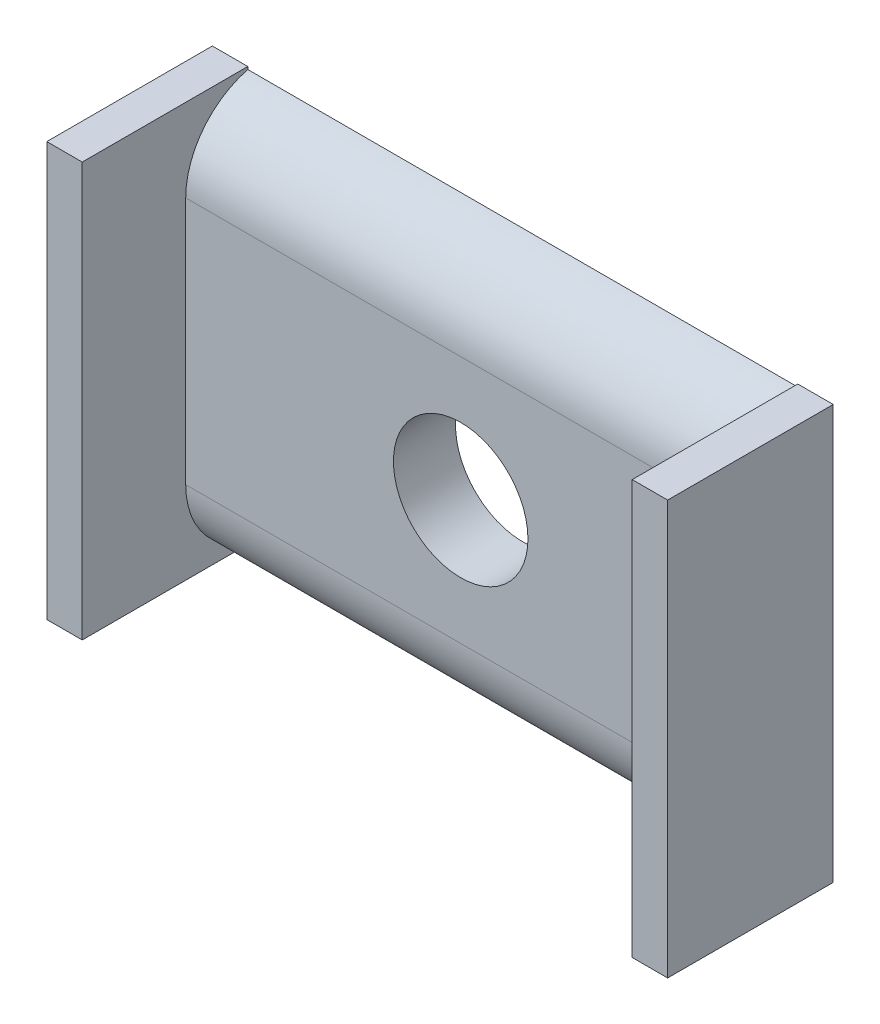
ISO-10303-21;
HEADER;
FILE_DESCRIPTION(('STEP AP214'),'2;1');
FILE_NAME('part.step','',(''),(''),'','','');
FILE_SCHEMA(('AUTOMOTIVE_DESIGN { 1 0 10303 214 1 1 1 1 }'));
ENDSEC;
DATA;
#1=APPLICATION_CONTEXT('core data for automotive mechanical design processes');
#2=APPLICATION_PROTOCOL_DEFINITION('international standard','automotive_design',2000,#1);
#3=PRODUCT_CONTEXT('',#1,'mechanical');
#4=PRODUCT('Part','Part','',(#3));
#5=PRODUCT_RELATED_PRODUCT_CATEGORY('part','',(#4));
#6=PRODUCT_DEFINITION_FORMATION('','',#4);
#7=PRODUCT_DEFINITION_CONTEXT('part definition',#1,'design');
#8=PRODUCT_DEFINITION('design','',#6,#7);
#9=PRODUCT_DEFINITION_SHAPE('','',#8);
#10=(LENGTH_UNIT() NAMED_UNIT(*) SI_UNIT(.MILLI.,.METRE.));
#11=(NAMED_UNIT(*) PLANE_ANGLE_UNIT() SI_UNIT($,.RADIAN.));
#12=(NAMED_UNIT(*) SI_UNIT($,.STERADIAN.) SOLID_ANGLE_UNIT());
#13=UNCERTAINTY_MEASURE_WITH_UNIT(LENGTH_MEASURE(1.E-05),#10,'distance_accuracy_value','');
#14=(GEOMETRIC_REPRESENTATION_CONTEXT(3) GLOBAL_UNCERTAINTY_ASSIGNED_CONTEXT((#13)) GLOBAL_UNIT_ASSIGNED_CONTEXT((#10,
#11,#12)) REPRESENTATION_CONTEXT('',''));
#15=CARTESIAN_POINT('',(0.,0.,0.));
#16=DIRECTION('',(0.,0.,1.));
#17=DIRECTION('',(1.,0.,0.));
#18=AXIS2_PLACEMENT_3D('',#15,#16,#17);
#19=CARTESIAN_POINT('',(-15.,-10.,3.));
#20=DIRECTION('',(0.,1.,0.));
#21=DIRECTION('',(0.,0.,1.));
#22=AXIS2_PLACEMENT_3D('',#19,#20,#21);
#23=PLANE('',#22);
#24=DIRECTION('',(0.,0.,-1.));
#25=VECTOR('',#24,1.);
#26=CARTESIAN_POINT('',(13.2870629953477,-10.,8.));
#27=LINE('',#26,#25);
#28=CARTESIAN_POINT('',(13.2870629953477,-10.,8.));
#29=VERTEX_POINT('',#28);
#30=CARTESIAN_POINT('',(13.2870629953477,-10.,0.));
#31=VERTEX_POINT('',#30);
#32=EDGE_CURVE('E58',#29,#31,#27,.T.);
#33=ORIENTED_EDGE('',*,*,#32,.T.);
#34=DIRECTION('',(1.,0.,0.));
#35=VECTOR('',#34,1.);
#36=CARTESIAN_POINT('',(-15.,-10.,0.));
#37=LINE('',#36,#35);
#38=CARTESIAN_POINT('',(15.,-10.,0.));
#39=VERTEX_POINT('',#38);
#40=EDGE_CURVE('E134',#31,#39,#37,.T.);
#41=ORIENTED_EDGE('',*,*,#40,.T.);
#42=DIRECTION('',(0.,0.,-1.));
#43=VECTOR('',#42,1.);
#44=CARTESIAN_POINT('',(15.,-10.,3.));
#45=LINE('',#44,#43);
#46=CARTESIAN_POINT('',(15.,-10.,8.));
#47=VERTEX_POINT('',#46);
#48=EDGE_CURVE('E130',#47,#39,#45,.T.);
#49=ORIENTED_EDGE('',*,*,#48,.F.);
#50=DIRECTION('',(1.,0.,0.));
#51=VECTOR('',#50,1.);
#52=CARTESIAN_POINT('',(15.,-10.,8.));
#53=LINE('',#52,#51);
#54=EDGE_CURVE('E132',#29,#47,#53,.T.);
#55=ORIENTED_EDGE('',*,*,#54,.F.);
#56=EDGE_LOOP('',(#33,#41,#49,#55));
#57=FACE_BOUND('',#56,.T.);
#58=ADVANCED_FACE('F42',(#57),#23,.F.);
#59=CARTESIAN_POINT('',(-15.,10.,3.));
#60=DIRECTION('',(0.,-1.,0.));
#61=DIRECTION('',(0.,0.,-1.));
#62=AXIS2_PLACEMENT_3D('',#59,#60,#61);
#63=PLANE('',#62);
#64=DIRECTION('',(0.,0.,-1.));
#65=VECTOR('',#64,1.);
#66=CARTESIAN_POINT('',(-13.2870629953477,10.,8.));
#67=LINE('',#66,#65);
#68=CARTESIAN_POINT('',(-13.2870629953477,10.,8.));
#69=VERTEX_POINT('',#68);
#70=CARTESIAN_POINT('',(-13.2870629953477,10.,0.));
#71=VERTEX_POINT('',#70);
#72=EDGE_CURVE('E181',#69,#71,#67,.T.);
#73=ORIENTED_EDGE('',*,*,#72,.T.);
#74=DIRECTION('',(-1.,0.,0.));
#75=VECTOR('',#74,1.);
#76=CARTESIAN_POINT('',(-15.,10.,0.));
#77=LINE('',#76,#75);
#78=CARTESIAN_POINT('',(-15.,10.,0.));
#79=VERTEX_POINT('',#78);
#80=EDGE_CURVE('E200',#71,#79,#77,.T.);
#81=ORIENTED_EDGE('',*,*,#80,.T.);
#82=DIRECTION('',(0.,0.,-1.));
#83=VECTOR('',#82,1.);
#84=CARTESIAN_POINT('',(-15.,10.,3.));
#85=LINE('',#84,#83);
#86=CARTESIAN_POINT('',(-15.,10.,8.));
#87=VERTEX_POINT('',#86);
#88=EDGE_CURVE('E214',#87,#79,#85,.T.);
#89=ORIENTED_EDGE('',*,*,#88,.F.);
#90=DIRECTION('',(-1.,0.,0.));
#91=VECTOR('',#90,1.);
#92=CARTESIAN_POINT('',(-15.,10.,8.));
#93=LINE('',#92,#91);
#94=EDGE_CURVE('E177',#69,#87,#93,.T.);
#95=ORIENTED_EDGE('',*,*,#94,.F.);
#96=EDGE_LOOP('',(#73,#81,#89,#95));
#97=FACE_BOUND('',#96,.T.);
#98=ADVANCED_FACE('F283',(#97),#63,.F.);
#99=CARTESIAN_POINT('',(0.,0.,3.));
#100=DIRECTION('',(0.,0.,-1.));
#101=DIRECTION('',(-1.,0.,0.));
#102=AXIS2_PLACEMENT_3D('',#99,#100,#101);
#103=PLANE('',#102);
#104=CARTESIAN_POINT('',(0.,0.,3.));
#105=DIRECTION('',(0.,0.,1.));
#106=DIRECTION('',(1.,0.,0.));
#107=AXIS2_PLACEMENT_3D('',#104,#105,#106);
#108=CIRCLE('',#107,3.25);
#109=CARTESIAN_POINT('',(3.25,0.,3.));
#110=VERTEX_POINT('',#109);
#111=EDGE_CURVE('E190',#110,#110,#108,.T.);
#112=ORIENTED_EDGE('',*,*,#111,.F.);
#113=EDGE_LOOP('',(#112));
#114=FACE_BOUND('',#113,.T.);
#115=DIRECTION('',(0.,1.,0.));
#116=VECTOR('',#115,1.);
#117=CARTESIAN_POINT('',(-13.2870629953477,10.,3.));
#118=LINE('',#117,#116);
#119=CARTESIAN_POINT('',(-13.2870629953477,-6.,3.));
#120=VERTEX_POINT('',#119);
#121=CARTESIAN_POINT('',(-13.2870629953477,6.,3.));
#122=VERTEX_POINT('',#121);
#123=EDGE_CURVE('E162',#120,#122,#118,.T.);
#124=ORIENTED_EDGE('',*,*,#123,.F.);
#125=DIRECTION('',(1.,0.,0.));
#126=VECTOR('',#125,1.);
#127=CARTESIAN_POINT('',(0.,-6.,3.));
#128=LINE('',#127,#126);
#129=CARTESIAN_POINT('',(13.2870629953477,-6.,3.));
#130=VERTEX_POINT('',#129);
#131=EDGE_CURVE('E242',#120,#130,#128,.T.);
#132=ORIENTED_EDGE('',*,*,#131,.T.);
#133=DIRECTION('',(0.,-1.,0.));
#134=VECTOR('',#133,1.);
#135=CARTESIAN_POINT('',(13.2870629953477,10.,3.));
#136=LINE('',#135,#134);
#137=CARTESIAN_POINT('',(13.2870629953477,6.,3.));
#138=VERTEX_POINT('',#137);
#139=EDGE_CURVE('E156',#138,#130,#136,.T.);
#140=ORIENTED_EDGE('',*,*,#139,.F.);
#141=DIRECTION('',(-1.,0.,0.));
#142=VECTOR('',#141,1.);
#143=CARTESIAN_POINT('',(0.,6.,3.));
#144=LINE('',#143,#142);
#145=EDGE_CURVE('E220',#138,#122,#144,.T.);
#146=ORIENTED_EDGE('',*,*,#145,.T.);
#147=EDGE_LOOP('',(#124,#132,#140,#146));
#148=FACE_BOUND('',#147,.T.);
#149=ADVANCED_FACE('F269',(#114,#148),#103,.F.);
#150=CARTESIAN_POINT('',(0.,0.,0.));
#151=DIRECTION('',(0.,0.,-1.));
#152=DIRECTION('',(-1.,0.,0.));
#153=AXIS2_PLACEMENT_3D('',#150,#151,#152);
#154=PLANE('',#153);
#155=ORIENTED_EDGE('',*,*,#40,.F.);
#156=DIRECTION('',(0.,1.,0.));
#157=VECTOR('',#156,1.);
#158=CARTESIAN_POINT('',(13.2870629953477,10.,0.));
#159=LINE('',#158,#157);
#160=CARTESIAN_POINT('',(13.2870629953477,-9.87298334620742,0.));
#161=VERTEX_POINT('',#160);
#162=EDGE_CURVE('E251',#31,#161,#159,.T.);
#163=ORIENTED_EDGE('',*,*,#162,.T.);
#164=DIRECTION('',(1.,0.,0.));
#165=VECTOR('',#164,1.);
#166=CARTESIAN_POINT('',(0.,-9.87298334620742,0.));
#167=LINE('',#166,#165);
#168=CARTESIAN_POINT('',(-13.2870629953477,-9.87298334620742,0.));
#169=VERTEX_POINT('',#168);
#170=EDGE_CURVE('E246',#161,#169,#167,.F.);
#171=ORIENTED_EDGE('',*,*,#170,.T.);
#172=DIRECTION('',(0.,-1.,0.));
#173=VECTOR('',#172,1.);
#174=CARTESIAN_POINT('',(-13.2870629953477,10.,0.));
#175=LINE('',#174,#173);
#176=CARTESIAN_POINT('',(-13.2870629953477,-10.,0.));
#177=VERTEX_POINT('',#176);
#178=EDGE_CURVE('E65',#169,#177,#175,.T.);
#179=ORIENTED_EDGE('',*,*,#178,.T.);
#180=CARTESIAN_POINT('',(-15.,-10.,0.));
#181=VERTEX_POINT('',#180);
#182=EDGE_CURVE('E141',#181,#177,#37,.T.);
#183=ORIENTED_EDGE('',*,*,#182,.F.);
#184=DIRECTION('',(0.,-1.,0.));
#185=VECTOR('',#184,1.);
#186=CARTESIAN_POINT('',(-15.,-10.,0.));
#187=LINE('',#186,#185);
#188=EDGE_CURVE('E205',#79,#181,#187,.T.);
#189=ORIENTED_EDGE('',*,*,#188,.F.);
#190=ORIENTED_EDGE('',*,*,#80,.F.);
#191=DIRECTION('',(0.,-1.,0.));
#192=VECTOR('',#191,1.);
#193=CARTESIAN_POINT('',(-13.2870629953477,10.,0.));
#194=LINE('',#193,#192);
#195=CARTESIAN_POINT('',(-13.2870629953477,9.87298334620742,0.));
#196=VERTEX_POINT('',#195);
#197=EDGE_CURVE('E232',#71,#196,#194,.T.);
#198=ORIENTED_EDGE('',*,*,#197,.T.);
#199=DIRECTION('',(-1.,0.,0.));
#200=VECTOR('',#199,1.);
#201=CARTESIAN_POINT('',(0.,9.87298334620742,0.));
#202=LINE('',#201,#200);
#203=CARTESIAN_POINT('',(13.2870629953477,9.87298334620742,0.));
#204=VERTEX_POINT('',#203);
#205=EDGE_CURVE('E224',#196,#204,#202,.F.);
#206=ORIENTED_EDGE('',*,*,#205,.T.);
#207=DIRECTION('',(0.,1.,0.));
#208=VECTOR('',#207,1.);
#209=CARTESIAN_POINT('',(13.2870629953477,10.,0.));
#210=LINE('',#209,#208);
#211=CARTESIAN_POINT('',(13.2870629953477,10.,0.));
#212=VERTEX_POINT('',#211);
#213=EDGE_CURVE('E228',#204,#212,#210,.T.);
#214=ORIENTED_EDGE('',*,*,#213,.T.);
#215=CARTESIAN_POINT('',(15.,10.,0.));
#216=VERTEX_POINT('',#215);
#217=EDGE_CURVE('E201',#216,#212,#77,.T.);
#218=ORIENTED_EDGE('',*,*,#217,.F.);
#219=DIRECTION('',(0.,1.,0.));
#220=VECTOR('',#219,1.);
#221=CARTESIAN_POINT('',(15.,-10.,0.));
#222=LINE('',#221,#220);
#223=EDGE_CURVE('E194',#39,#216,#222,.T.);
#224=ORIENTED_EDGE('',*,*,#223,.F.);
#225=EDGE_LOOP('',(#155,#163,#171,#179,#183,#189,#190,#198,#206,#214,#218,#224));
#226=FACE_BOUND('',#225,.T.);
#227=CARTESIAN_POINT('',(0.,0.,0.));
#228=DIRECTION('',(0.,0.,1.));
#229=DIRECTION('',(1.,0.,0.));
#230=AXIS2_PLACEMENT_3D('',#227,#228,#229);
#231=CIRCLE('',#230,3.25);
#232=CARTESIAN_POINT('',(3.25,0.,0.));
#233=VERTEX_POINT('',#232);
#234=EDGE_CURVE('E189',#233,#233,#231,.T.);
#235=ORIENTED_EDGE('',*,*,#234,.T.);
#236=EDGE_LOOP('',(#235));
#237=FACE_BOUND('',#236,.T.);
#238=ADVANCED_FACE('F262',(#226,#237),#154,.T.);
#239=CARTESIAN_POINT('',(15.,-10.,3.));
#240=DIRECTION('',(-1.,0.,0.));
#241=DIRECTION('',(0.,0.,1.));
#242=AXIS2_PLACEMENT_3D('',#239,#240,#241);
#243=PLANE('',#242);
#244=ORIENTED_EDGE('',*,*,#223,.T.);
#245=DIRECTION('',(0.,0.,-1.));
#246=VECTOR('',#245,1.);
#247=CARTESIAN_POINT('',(15.,10.,3.));
#248=LINE('',#247,#246);
#249=CARTESIAN_POINT('',(15.,10.,8.));
#250=VERTEX_POINT('',#249);
#251=EDGE_CURVE('E153',#250,#216,#248,.T.);
#252=ORIENTED_EDGE('',*,*,#251,.F.);
#253=DIRECTION('',(0.,1.,0.));
#254=VECTOR('',#253,1.);
#255=CARTESIAN_POINT('',(15.,10.,8.));
#256=LINE('',#255,#254);
#257=EDGE_CURVE('E146',#47,#250,#256,.T.);
#258=ORIENTED_EDGE('',*,*,#257,.F.);
#259=ORIENTED_EDGE('',*,*,#48,.T.);
#260=EDGE_LOOP('',(#244,#252,#258,#259));
#261=FACE_BOUND('',#260,.T.);
#262=ADVANCED_FACE('F151',(#261),#243,.F.);
#263=ORIENTED_EDGE('',*,*,#217,.T.);
#264=DIRECTION('',(0.,0.,-1.));
#265=VECTOR('',#264,1.);
#266=CARTESIAN_POINT('',(13.2870629953477,10.,8.));
#267=LINE('',#266,#265);
#268=CARTESIAN_POINT('',(13.2870629953477,10.,8.));
#269=VERTEX_POINT('',#268);
#270=EDGE_CURVE('E328',#269,#212,#267,.T.);
#271=ORIENTED_EDGE('',*,*,#270,.F.);
#272=DIRECTION('',(-1.,0.,0.));
#273=VECTOR('',#272,1.);
#274=CARTESIAN_POINT('',(15.,10.,8.));
#275=LINE('',#274,#273);
#276=EDGE_CURVE('E157',#250,#269,#275,.T.);
#277=ORIENTED_EDGE('',*,*,#276,.F.);
#278=ORIENTED_EDGE('',*,*,#251,.T.);
#279=EDGE_LOOP('',(#263,#271,#277,#278));
#280=FACE_BOUND('',#279,.T.);
#281=ADVANCED_FACE('F306',(#280),#63,.F.);
#282=CARTESIAN_POINT('',(-15.,-10.,3.));
#283=DIRECTION('',(1.,0.,0.));
#284=DIRECTION('',(0.,0.,-1.));
#285=AXIS2_PLACEMENT_3D('',#282,#283,#284);
#286=PLANE('',#285);
#287=ORIENTED_EDGE('',*,*,#188,.T.);
#288=DIRECTION('',(0.,0.,-1.));
#289=VECTOR('',#288,1.);
#290=CARTESIAN_POINT('',(-15.,-10.,3.));
#291=LINE('',#290,#289);
#292=CARTESIAN_POINT('',(-15.,-10.,8.));
#293=VERTEX_POINT('',#292);
#294=EDGE_CURVE('E140',#293,#181,#291,.T.);
#295=ORIENTED_EDGE('',*,*,#294,.F.);
#296=DIRECTION('',(0.,-1.,0.));
#297=VECTOR('',#296,1.);
#298=CARTESIAN_POINT('',(-15.,10.,8.));
#299=LINE('',#298,#297);
#300=EDGE_CURVE('E167',#87,#293,#299,.T.);
#301=ORIENTED_EDGE('',*,*,#300,.F.);
#302=ORIENTED_EDGE('',*,*,#88,.T.);
#303=EDGE_LOOP('',(#287,#295,#301,#302));
#304=FACE_BOUND('',#303,.T.);
#305=ADVANCED_FACE('F287',(#304),#286,.F.);
#306=ORIENTED_EDGE('',*,*,#182,.T.);
#307=DIRECTION('',(0.,0.,-1.));
#308=VECTOR('',#307,1.);
#309=CARTESIAN_POINT('',(-13.2870629953477,-10.,8.));
#310=LINE('',#309,#308);
#311=CARTESIAN_POINT('',(-13.2870629953477,-10.,8.));
#312=VERTEX_POINT('',#311);
#313=EDGE_CURVE('E186',#312,#177,#310,.T.);
#314=ORIENTED_EDGE('',*,*,#313,.F.);
#315=DIRECTION('',(1.,0.,0.));
#316=VECTOR('',#315,1.);
#317=CARTESIAN_POINT('',(-15.,-10.,8.));
#318=LINE('',#317,#316);
#319=EDGE_CURVE('E171',#293,#312,#318,.T.);
#320=ORIENTED_EDGE('',*,*,#319,.F.);
#321=ORIENTED_EDGE('',*,*,#294,.T.);
#322=EDGE_LOOP('',(#306,#314,#320,#321));
#323=FACE_BOUND('',#322,.T.);
#324=ADVANCED_FACE('F294',(#323),#23,.F.);
#325=CARTESIAN_POINT('',(0.,0.,3.));
#326=DIRECTION('',(0.,0.,-1.));
#327=DIRECTION('',(-1.,0.,0.));
#328=AXIS2_PLACEMENT_3D('',#325,#326,#327);
#329=CYLINDRICAL_SURFACE('',#328,3.25);
#330=ORIENTED_EDGE('',*,*,#111,.T.);
#331=EDGE_LOOP('',(#330));
#332=FACE_BOUND('',#331,.T.);
#333=ORIENTED_EDGE('',*,*,#234,.F.);
#334=EDGE_LOOP('',(#333));
#335=FACE_BOUND('',#334,.T.);
#336=ADVANCED_FACE('F296',(#332,#335),#329,.F.);
#337=CARTESIAN_POINT('',(-13.2870629953477,10.,8.));
#338=DIRECTION('',(-1.,0.,0.));
#339=DIRECTION('',(0.,0.,1.));
#340=AXIS2_PLACEMENT_3D('',#337,#338,#339);
#341=PLANE('',#340);
#342=ORIENTED_EDGE('',*,*,#313,.T.);
#343=ORIENTED_EDGE('',*,*,#178,.F.);
#344=CARTESIAN_POINT('',(-13.2870629953477,-6.,-1.));
#345=DIRECTION('',(-1.,0.,0.));
#346=DIRECTION('',(0.,0.,1.));
#347=AXIS2_PLACEMENT_3D('',#344,#345,#346);
#348=CIRCLE('',#347,4.);
#349=EDGE_CURVE('E11',#169,#120,#348,.T.);
#350=ORIENTED_EDGE('',*,*,#349,.T.);
#351=ORIENTED_EDGE('',*,*,#123,.T.);
#352=CARTESIAN_POINT('',(-13.2870629953477,6.,-1.));
#353=DIRECTION('',(-1.,0.,0.));
#354=DIRECTION('',(0.,0.,1.));
#355=AXIS2_PLACEMENT_3D('',#352,#353,#354);
#356=CIRCLE('',#355,4.);
#357=EDGE_CURVE('E236',#122,#196,#356,.T.);
#358=ORIENTED_EDGE('',*,*,#357,.T.);
#359=ORIENTED_EDGE('',*,*,#197,.F.);
#360=ORIENTED_EDGE('',*,*,#72,.F.);
#361=DIRECTION('',(0.,1.,0.));
#362=VECTOR('',#361,1.);
#363=CARTESIAN_POINT('',(-13.2870629953477,10.,8.));
#364=LINE('',#363,#362);
#365=EDGE_CURVE('E174',#312,#69,#364,.T.);
#366=ORIENTED_EDGE('',*,*,#365,.F.);
#367=EDGE_LOOP('',(#342,#343,#350,#351,#358,#359,#360,#366));
#368=FACE_BOUND('',#367,.T.);
#369=ADVANCED_FACE('F266',(#368),#341,.F.);
#370=CARTESIAN_POINT('',(0.,0.,8.));
#371=DIRECTION('',(0.,0.,1.));
#372=DIRECTION('',(1.,0.,0.));
#373=AXIS2_PLACEMENT_3D('',#370,#371,#372);
#374=PLANE('',#373);
#375=ORIENTED_EDGE('',*,*,#300,.T.);
#376=ORIENTED_EDGE('',*,*,#319,.T.);
#377=ORIENTED_EDGE('',*,*,#365,.T.);
#378=ORIENTED_EDGE('',*,*,#94,.T.);
#379=EDGE_LOOP('',(#375,#376,#377,#378));
#380=FACE_BOUND('',#379,.T.);
#381=ADVANCED_FACE('F290',(#380),#374,.T.);
#382=CARTESIAN_POINT('',(13.2870629953477,10.,8.));
#383=DIRECTION('',(1.,0.,0.));
#384=DIRECTION('',(0.,0.,-1.));
#385=AXIS2_PLACEMENT_3D('',#382,#383,#384);
#386=PLANE('',#385);
#387=ORIENTED_EDGE('',*,*,#270,.T.);
#388=ORIENTED_EDGE('',*,*,#213,.F.);
#389=CARTESIAN_POINT('',(13.2870629953477,6.,-1.));
#390=DIRECTION('',(1.,0.,0.));
#391=DIRECTION('',(0.,0.,-1.));
#392=AXIS2_PLACEMENT_3D('',#389,#390,#391);
#393=CIRCLE('',#392,4.);
#394=EDGE_CURVE('E239',#204,#138,#393,.T.);
#395=ORIENTED_EDGE('',*,*,#394,.T.);
#396=ORIENTED_EDGE('',*,*,#139,.T.);
#397=CARTESIAN_POINT('',(13.2870629953477,-6.,-1.));
#398=DIRECTION('',(1.,0.,0.));
#399=DIRECTION('',(0.,0.,-1.));
#400=AXIS2_PLACEMENT_3D('',#397,#398,#399);
#401=CIRCLE('',#400,4.);
#402=EDGE_CURVE('E51',#130,#161,#401,.T.);
#403=ORIENTED_EDGE('',*,*,#402,.T.);
#404=ORIENTED_EDGE('',*,*,#162,.F.);
#405=ORIENTED_EDGE('',*,*,#32,.F.);
#406=DIRECTION('',(0.,-1.,0.));
#407=VECTOR('',#406,1.);
#408=CARTESIAN_POINT('',(13.2870629953477,10.,8.));
#409=LINE('',#408,#407);
#410=EDGE_CURVE('E148',#269,#29,#409,.T.);
#411=ORIENTED_EDGE('',*,*,#410,.F.);
#412=EDGE_LOOP('',(#387,#388,#395,#396,#403,#404,#405,#411));
#413=FACE_BOUND('',#412,.T.);
#414=ADVANCED_FACE('F256',(#413),#386,.F.);
#415=CARTESIAN_POINT('',(0.,0.,8.));
#416=DIRECTION('',(0.,0.,-1.));
#417=DIRECTION('',(-1.,0.,0.));
#418=AXIS2_PLACEMENT_3D('',#415,#416,#417);
#419=PLANE('',#418);
#420=ORIENTED_EDGE('',*,*,#257,.T.);
#421=ORIENTED_EDGE('',*,*,#276,.T.);
#422=ORIENTED_EDGE('',*,*,#410,.T.);
#423=ORIENTED_EDGE('',*,*,#54,.T.);
#424=EDGE_LOOP('',(#420,#421,#422,#423));
#425=FACE_BOUND('',#424,.T.);
#426=ADVANCED_FACE('F145',(#425),#419,.F.);
#427=CARTESIAN_POINT('',(0.,6.,-1.));
#428=DIRECTION('',(-1.,0.,0.));
#429=DIRECTION('',(0.,0.,1.));
#430=AXIS2_PLACEMENT_3D('',#427,#428,#429);
#431=CYLINDRICAL_SURFACE('',#430,4.);
#432=ORIENTED_EDGE('',*,*,#394,.F.);
#433=ORIENTED_EDGE('',*,*,#205,.F.);
#434=ORIENTED_EDGE('',*,*,#357,.F.);
#435=ORIENTED_EDGE('',*,*,#145,.F.);
#436=EDGE_LOOP('',(#432,#433,#434,#435));
#437=FACE_BOUND('',#436,.T.);
#438=ADVANCED_FACE('F273',(#437),#431,.T.);
#439=CARTESIAN_POINT('',(0.,-6.,-1.));
#440=DIRECTION('',(1.,0.,0.));
#441=DIRECTION('',(0.,0.,-1.));
#442=AXIS2_PLACEMENT_3D('',#439,#440,#441);
#443=CYLINDRICAL_SURFACE('',#442,4.);
#444=ORIENTED_EDGE('',*,*,#349,.F.);
#445=ORIENTED_EDGE('',*,*,#170,.F.);
#446=ORIENTED_EDGE('',*,*,#402,.F.);
#447=ORIENTED_EDGE('',*,*,#131,.F.);
#448=EDGE_LOOP('',(#444,#445,#446,#447));
#449=FACE_BOUND('',#448,.T.);
#450=ADVANCED_FACE('F44',(#449),#443,.T.);
#451=CLOSED_SHELL('',(#58,#98,#149,#238,#262,#281,#305,#324,#336,#369,#381,#414,#426,#438,#450));
#452=MANIFOLD_SOLID_BREP('B2',#451);
#453=ADVANCED_BREP_SHAPE_REPRESENTATION('',(#18,#452),#14);
#454=SHAPE_DEFINITION_REPRESENTATION(#9,#453);
ENDSEC;
END-ISO-10303-21;
